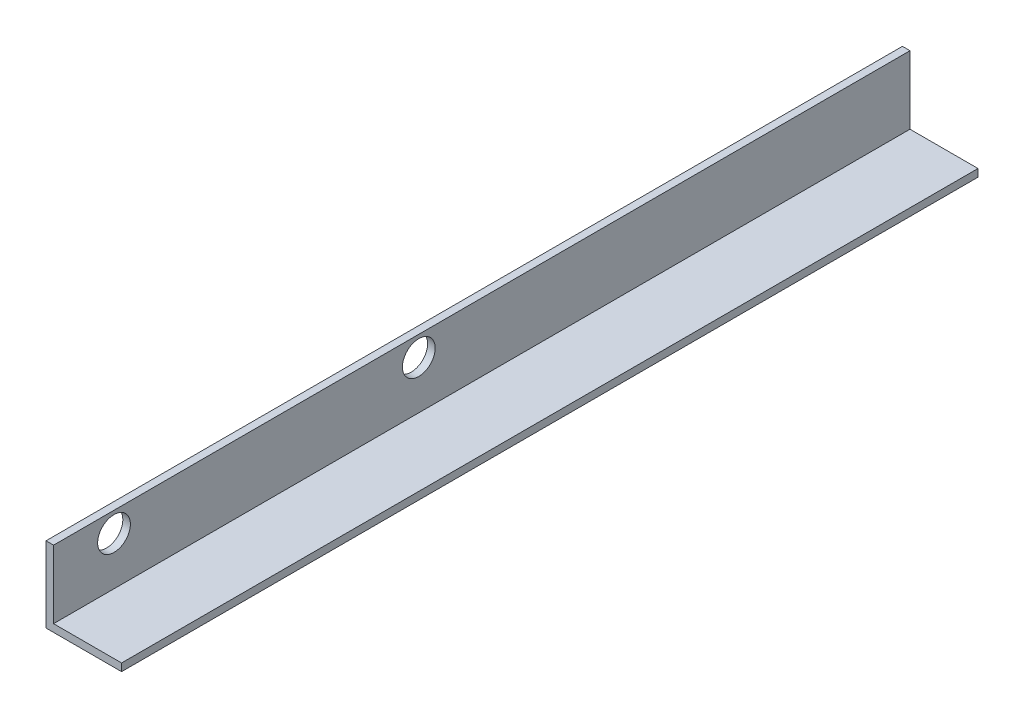
ISO-10303-21;
HEADER;
FILE_DESCRIPTION(('STEP AP214'),'2;1');
FILE_NAME('part.step','',(''),(''),'','','');
FILE_SCHEMA(('AUTOMOTIVE_DESIGN { 1 0 10303 214 1 1 1 1 }'));
ENDSEC;
DATA;
#1=APPLICATION_CONTEXT('core data for automotive mechanical design processes');
#2=APPLICATION_PROTOCOL_DEFINITION('international standard','automotive_design',2000,#1);
#3=PRODUCT_CONTEXT('',#1,'mechanical');
#4=PRODUCT('Part','Part','',(#3));
#5=PRODUCT_RELATED_PRODUCT_CATEGORY('part','',(#4));
#6=PRODUCT_DEFINITION_FORMATION('','',#4);
#7=PRODUCT_DEFINITION_CONTEXT('part definition',#1,'design');
#8=PRODUCT_DEFINITION('design','',#6,#7);
#9=PRODUCT_DEFINITION_SHAPE('','',#8);
#10=(LENGTH_UNIT() NAMED_UNIT(*) SI_UNIT(.MILLI.,.METRE.));
#11=(NAMED_UNIT(*) PLANE_ANGLE_UNIT() SI_UNIT($,.RADIAN.));
#12=(NAMED_UNIT(*) SI_UNIT($,.STERADIAN.) SOLID_ANGLE_UNIT());
#13=UNCERTAINTY_MEASURE_WITH_UNIT(LENGTH_MEASURE(1.E-05),#10,'distance_accuracy_value','');
#14=(GEOMETRIC_REPRESENTATION_CONTEXT(3) GLOBAL_UNCERTAINTY_ASSIGNED_CONTEXT((#13)) GLOBAL_UNIT_ASSIGNED_CONTEXT((#10,
#11,#12)) REPRESENTATION_CONTEXT('',''));
#15=CARTESIAN_POINT('',(0.,0.,0.));
#16=DIRECTION('',(0.,0.,1.));
#17=DIRECTION('',(1.,0.,0.));
#18=AXIS2_PLACEMENT_3D('',#15,#16,#17);
#19=CARTESIAN_POINT('',(3.,30.,340.));
#20=DIRECTION('',(0.,-1.,0.));
#21=DIRECTION('',(0.,0.,-1.));
#22=AXIS2_PLACEMENT_3D('',#19,#20,#21);
#23=PLANE('',#22);
#24=DIRECTION('',(-1.,0.,0.));
#25=VECTOR('',#24,1.);
#26=CARTESIAN_POINT('',(3.,30.,0.));
#27=LINE('',#26,#25);
#28=CARTESIAN_POINT('',(3.,30.,0.));
#29=VERTEX_POINT('',#28);
#30=CARTESIAN_POINT('',(0.,30.,0.));
#31=VERTEX_POINT('',#30);
#32=EDGE_CURVE('E119',#29,#31,#27,.T.);
#33=ORIENTED_EDGE('',*,*,#32,.T.);
#34=DIRECTION('',(0.,0.,-1.));
#35=VECTOR('',#34,1.);
#36=CARTESIAN_POINT('',(0.,30.,340.));
#37=LINE('',#36,#35);
#38=CARTESIAN_POINT('',(0.,30.,340.));
#39=VERTEX_POINT('',#38);
#40=EDGE_CURVE('E11',#39,#31,#37,.T.);
#41=ORIENTED_EDGE('',*,*,#40,.F.);
#42=DIRECTION('',(-1.,0.,0.));
#43=VECTOR('',#42,1.);
#44=CARTESIAN_POINT('',(3.,30.,340.));
#45=LINE('',#44,#43);
#46=CARTESIAN_POINT('',(3.,30.,340.));
#47=VERTEX_POINT('',#46);
#48=EDGE_CURVE('E130',#47,#39,#45,.T.);
#49=ORIENTED_EDGE('',*,*,#48,.F.);
#50=DIRECTION('',(0.,0.,-1.));
#51=VECTOR('',#50,1.);
#52=CARTESIAN_POINT('',(3.,30.,340.));
#53=LINE('',#52,#51);
#54=EDGE_CURVE('E115',#47,#29,#53,.T.);
#55=ORIENTED_EDGE('',*,*,#54,.T.);
#56=EDGE_LOOP('',(#33,#41,#49,#55));
#57=FACE_BOUND('',#56,.T.);
#58=ADVANCED_FACE('F35',(#57),#23,.F.);
#59=CARTESIAN_POINT('',(0.,30.,340.));
#60=DIRECTION('',(1.,0.,0.));
#61=DIRECTION('',(0.,0.,-1.));
#62=AXIS2_PLACEMENT_3D('',#59,#60,#61);
#63=PLANE('',#62);
#64=CARTESIAN_POINT('',(0.,22.,195.));
#65=DIRECTION('',(1.,0.,0.));
#66=DIRECTION('',(0.,0.,-1.));
#67=AXIS2_PLACEMENT_3D('',#64,#65,#66);
#68=CIRCLE('',#67,6.50000000000002);
#69=CARTESIAN_POINT('',(0.,22.,188.5));
#70=VERTEX_POINT('',#69);
#71=EDGE_CURVE('E123',#70,#70,#68,.T.);
#72=ORIENTED_EDGE('',*,*,#71,.T.);
#73=EDGE_LOOP('',(#72));
#74=FACE_BOUND('',#73,.T.);
#75=CARTESIAN_POINT('',(0.,22.,316.));
#76=DIRECTION('',(1.,0.,0.));
#77=DIRECTION('',(0.,0.,-1.));
#78=AXIS2_PLACEMENT_3D('',#75,#76,#77);
#79=CIRCLE('',#78,6.50000000000002);
#80=CARTESIAN_POINT('',(0.,22.,309.5));
#81=VERTEX_POINT('',#80);
#82=EDGE_CURVE('E221',#81,#81,#79,.T.);
#83=ORIENTED_EDGE('',*,*,#82,.T.);
#84=EDGE_LOOP('',(#83));
#85=FACE_BOUND('',#84,.T.);
#86=DIRECTION('',(0.,-1.,0.));
#87=VECTOR('',#86,1.);
#88=CARTESIAN_POINT('',(0.,30.,0.));
#89=LINE('',#88,#87);
#90=CARTESIAN_POINT('',(0.,0.,0.));
#91=VERTEX_POINT('',#90);
#92=EDGE_CURVE('E122',#31,#91,#89,.T.);
#93=ORIENTED_EDGE('',*,*,#92,.T.);
#94=DIRECTION('',(0.,0.,-1.));
#95=VECTOR('',#94,1.);
#96=CARTESIAN_POINT('',(0.,0.,340.));
#97=LINE('',#96,#95);
#98=CARTESIAN_POINT('',(0.,0.,340.));
#99=VERTEX_POINT('',#98);
#100=EDGE_CURVE('E43',#99,#91,#97,.T.);
#101=ORIENTED_EDGE('',*,*,#100,.F.);
#102=DIRECTION('',(0.,-1.,0.));
#103=VECTOR('',#102,1.);
#104=CARTESIAN_POINT('',(0.,30.,340.));
#105=LINE('',#104,#103);
#106=EDGE_CURVE('E88',#39,#99,#105,.T.);
#107=ORIENTED_EDGE('',*,*,#106,.F.);
#108=ORIENTED_EDGE('',*,*,#40,.T.);
#109=EDGE_LOOP('',(#93,#101,#107,#108));
#110=FACE_BOUND('',#109,.T.);
#111=ADVANCED_FACE('F159',(#74,#85,#110),#63,.F.);
#112=CARTESIAN_POINT('',(0.,0.,340.));
#113=DIRECTION('',(0.,1.,0.));
#114=DIRECTION('',(0.,0.,1.));
#115=AXIS2_PLACEMENT_3D('',#112,#113,#114);
#116=PLANE('',#115);
#117=DIRECTION('',(1.,0.,0.));
#118=VECTOR('',#117,1.);
#119=CARTESIAN_POINT('',(0.,0.,0.));
#120=LINE('',#119,#118);
#121=CARTESIAN_POINT('',(30.,0.,0.));
#122=VERTEX_POINT('',#121);
#123=EDGE_CURVE('E125',#91,#122,#120,.T.);
#124=ORIENTED_EDGE('',*,*,#123,.T.);
#125=DIRECTION('',(0.,0.,-1.));
#126=VECTOR('',#125,1.);
#127=CARTESIAN_POINT('',(30.,0.,340.));
#128=LINE('',#127,#126);
#129=CARTESIAN_POINT('',(30.,0.,340.));
#130=VERTEX_POINT('',#129);
#131=EDGE_CURVE('E110',#130,#122,#128,.T.);
#132=ORIENTED_EDGE('',*,*,#131,.F.);
#133=DIRECTION('',(1.,0.,0.));
#134=VECTOR('',#133,1.);
#135=CARTESIAN_POINT('',(0.,0.,340.));
#136=LINE('',#135,#134);
#137=EDGE_CURVE('E101',#99,#130,#136,.T.);
#138=ORIENTED_EDGE('',*,*,#137,.F.);
#139=ORIENTED_EDGE('',*,*,#100,.T.);
#140=EDGE_LOOP('',(#124,#132,#138,#139));
#141=FACE_BOUND('',#140,.T.);
#142=ADVANCED_FACE('F136',(#141),#116,.F.);
#143=CARTESIAN_POINT('',(30.,0.,340.));
#144=DIRECTION('',(-1.,0.,0.));
#145=DIRECTION('',(0.,0.,1.));
#146=AXIS2_PLACEMENT_3D('',#143,#144,#145);
#147=PLANE('',#146);
#148=DIRECTION('',(0.,1.,0.));
#149=VECTOR('',#148,1.);
#150=CARTESIAN_POINT('',(30.,0.,0.));
#151=LINE('',#150,#149);
#152=CARTESIAN_POINT('',(30.,3.,0.));
#153=VERTEX_POINT('',#152);
#154=EDGE_CURVE('E109',#122,#153,#151,.T.);
#155=ORIENTED_EDGE('',*,*,#154,.T.);
#156=DIRECTION('',(0.,0.,-1.));
#157=VECTOR('',#156,1.);
#158=CARTESIAN_POINT('',(30.,3.,340.));
#159=LINE('',#158,#157);
#160=CARTESIAN_POINT('',(30.,3.,340.));
#161=VERTEX_POINT('',#160);
#162=EDGE_CURVE('E106',#161,#153,#159,.T.);
#163=ORIENTED_EDGE('',*,*,#162,.F.);
#164=DIRECTION('',(0.,1.,0.));
#165=VECTOR('',#164,1.);
#166=CARTESIAN_POINT('',(30.,0.,340.));
#167=LINE('',#166,#165);
#168=EDGE_CURVE('E95',#130,#161,#167,.T.);
#169=ORIENTED_EDGE('',*,*,#168,.F.);
#170=ORIENTED_EDGE('',*,*,#131,.T.);
#171=EDGE_LOOP('',(#155,#163,#169,#170));
#172=FACE_BOUND('',#171,.T.);
#173=ADVANCED_FACE('F107',(#172),#147,.F.);
#174=CARTESIAN_POINT('',(30.,3.,340.));
#175=DIRECTION('',(0.,-1.,0.));
#176=DIRECTION('',(1.,0.,0.));
#177=AXIS2_PLACEMENT_3D('',#174,#175,#176);
#178=PLANE('',#177);
#179=DIRECTION('',(-1.,0.,0.));
#180=VECTOR('',#179,1.);
#181=CARTESIAN_POINT('',(30.,3.,0.));
#182=LINE('',#181,#180);
#183=CARTESIAN_POINT('',(3.,3.,0.));
#184=VERTEX_POINT('',#183);
#185=EDGE_CURVE('E74',#153,#184,#182,.T.);
#186=ORIENTED_EDGE('',*,*,#185,.T.);
#187=DIRECTION('',(0.,0.,-1.));
#188=VECTOR('',#187,1.);
#189=CARTESIAN_POINT('',(3.,3.,340.));
#190=LINE('',#189,#188);
#191=CARTESIAN_POINT('',(3.,3.,340.));
#192=VERTEX_POINT('',#191);
#193=EDGE_CURVE('E111',#192,#184,#190,.T.);
#194=ORIENTED_EDGE('',*,*,#193,.F.);
#195=DIRECTION('',(-1.,0.,0.));
#196=VECTOR('',#195,1.);
#197=CARTESIAN_POINT('',(30.,3.,340.));
#198=LINE('',#197,#196);
#199=EDGE_CURVE('E99',#161,#192,#198,.T.);
#200=ORIENTED_EDGE('',*,*,#199,.F.);
#201=ORIENTED_EDGE('',*,*,#162,.T.);
#202=EDGE_LOOP('',(#186,#194,#200,#201));
#203=FACE_BOUND('',#202,.T.);
#204=ADVANCED_FACE('F113',(#203),#178,.F.);
#205=CARTESIAN_POINT('',(3.,3.,340.));
#206=DIRECTION('',(-1.,0.,0.));
#207=DIRECTION('',(0.,0.,1.));
#208=AXIS2_PLACEMENT_3D('',#205,#206,#207);
#209=PLANE('',#208);
#210=CARTESIAN_POINT('',(3.,22.,195.));
#211=DIRECTION('',(1.,0.,0.));
#212=DIRECTION('',(0.,0.,-1.));
#213=AXIS2_PLACEMENT_3D('',#210,#211,#212);
#214=CIRCLE('',#213,6.50000000000002);
#215=CARTESIAN_POINT('',(3.,22.,188.5));
#216=VERTEX_POINT('',#215);
#217=EDGE_CURVE('E220',#216,#216,#214,.T.);
#218=ORIENTED_EDGE('',*,*,#217,.F.);
#219=EDGE_LOOP('',(#218));
#220=FACE_BOUND('',#219,.T.);
#221=CARTESIAN_POINT('',(3.,22.,316.));
#222=DIRECTION('',(1.,0.,0.));
#223=DIRECTION('',(0.,0.,-1.));
#224=AXIS2_PLACEMENT_3D('',#221,#222,#223);
#225=CIRCLE('',#224,6.50000000000002);
#226=CARTESIAN_POINT('',(3.,22.,309.5));
#227=VERTEX_POINT('',#226);
#228=EDGE_CURVE('E225',#227,#227,#225,.T.);
#229=ORIENTED_EDGE('',*,*,#228,.F.);
#230=EDGE_LOOP('',(#229));
#231=FACE_BOUND('',#230,.T.);
#232=DIRECTION('',(0.,1.,0.));
#233=VECTOR('',#232,1.);
#234=CARTESIAN_POINT('',(3.,3.,0.));
#235=LINE('',#234,#233);
#236=EDGE_CURVE('E80',#184,#29,#235,.T.);
#237=ORIENTED_EDGE('',*,*,#236,.T.);
#238=ORIENTED_EDGE('',*,*,#54,.F.);
#239=DIRECTION('',(0.,1.,0.));
#240=VECTOR('',#239,1.);
#241=CARTESIAN_POINT('',(3.,3.,340.));
#242=LINE('',#241,#240);
#243=EDGE_CURVE('E51',#192,#47,#242,.T.);
#244=ORIENTED_EDGE('',*,*,#243,.F.);
#245=ORIENTED_EDGE('',*,*,#193,.T.);
#246=EDGE_LOOP('',(#237,#238,#244,#245));
#247=FACE_BOUND('',#246,.T.);
#248=ADVANCED_FACE('F143',(#220,#231,#247),#209,.F.);
#249=CARTESIAN_POINT('',(0.,0.,340.));
#250=DIRECTION('',(0.,0.,1.));
#251=DIRECTION('',(1.,0.,0.));
#252=AXIS2_PLACEMENT_3D('',#249,#250,#251);
#253=PLANE('',#252);
#254=ORIENTED_EDGE('',*,*,#48,.T.);
#255=ORIENTED_EDGE('',*,*,#106,.T.);
#256=ORIENTED_EDGE('',*,*,#137,.T.);
#257=ORIENTED_EDGE('',*,*,#168,.T.);
#258=ORIENTED_EDGE('',*,*,#199,.T.);
#259=ORIENTED_EDGE('',*,*,#243,.T.);
#260=EDGE_LOOP('',(#254,#255,#256,#257,#258,#259));
#261=FACE_BOUND('',#260,.T.);
#262=ADVANCED_FACE('F97',(#261),#253,.T.);
#263=CARTESIAN_POINT('',(0.,0.,0.));
#264=DIRECTION('',(0.,0.,1.));
#265=DIRECTION('',(1.,0.,0.));
#266=AXIS2_PLACEMENT_3D('',#263,#264,#265);
#267=PLANE('',#266);
#268=ORIENTED_EDGE('',*,*,#32,.F.);
#269=ORIENTED_EDGE('',*,*,#236,.F.);
#270=ORIENTED_EDGE('',*,*,#185,.F.);
#271=ORIENTED_EDGE('',*,*,#154,.F.);
#272=ORIENTED_EDGE('',*,*,#123,.F.);
#273=ORIENTED_EDGE('',*,*,#92,.F.);
#274=EDGE_LOOP('',(#268,#269,#270,#271,#272,#273));
#275=FACE_BOUND('',#274,.T.);
#276=ADVANCED_FACE('F139',(#275),#267,.F.);
#277=CARTESIAN_POINT('',(0.,22.,316.));
#278=DIRECTION('',(1.,0.,0.));
#279=DIRECTION('',(0.,0.,-1.));
#280=AXIS2_PLACEMENT_3D('',#277,#278,#279);
#281=CYLINDRICAL_SURFACE('',#280,6.50000000000002);
#282=ORIENTED_EDGE('',*,*,#82,.F.);
#283=EDGE_LOOP('',(#282));
#284=FACE_BOUND('',#283,.T.);
#285=ORIENTED_EDGE('',*,*,#228,.T.);
#286=EDGE_LOOP('',(#285));
#287=FACE_BOUND('',#286,.T.);
#288=ADVANCED_FACE('F193',(#284,#287),#281,.F.);
#289=CARTESIAN_POINT('',(0.,22.,195.));
#290=DIRECTION('',(1.,0.,0.));
#291=DIRECTION('',(0.,0.,-1.));
#292=AXIS2_PLACEMENT_3D('',#289,#290,#291);
#293=CYLINDRICAL_SURFACE('',#292,6.50000000000002);
#294=ORIENTED_EDGE('',*,*,#71,.F.);
#295=EDGE_LOOP('',(#294));
#296=FACE_BOUND('',#295,.T.);
#297=ORIENTED_EDGE('',*,*,#217,.T.);
#298=EDGE_LOOP('',(#297));
#299=FACE_BOUND('',#298,.T.);
#300=ADVANCED_FACE('F198',(#296,#299),#293,.F.);
#301=CLOSED_SHELL('',(#58,#111,#142,#173,#204,#248,#262,#276,#288,#300));
#302=MANIFOLD_SOLID_BREP('B2',#301);
#303=ADVANCED_BREP_SHAPE_REPRESENTATION('',(#18,#302),#14);
#304=SHAPE_DEFINITION_REPRESENTATION(#9,#303);
ENDSEC;
END-ISO-10303-21;
